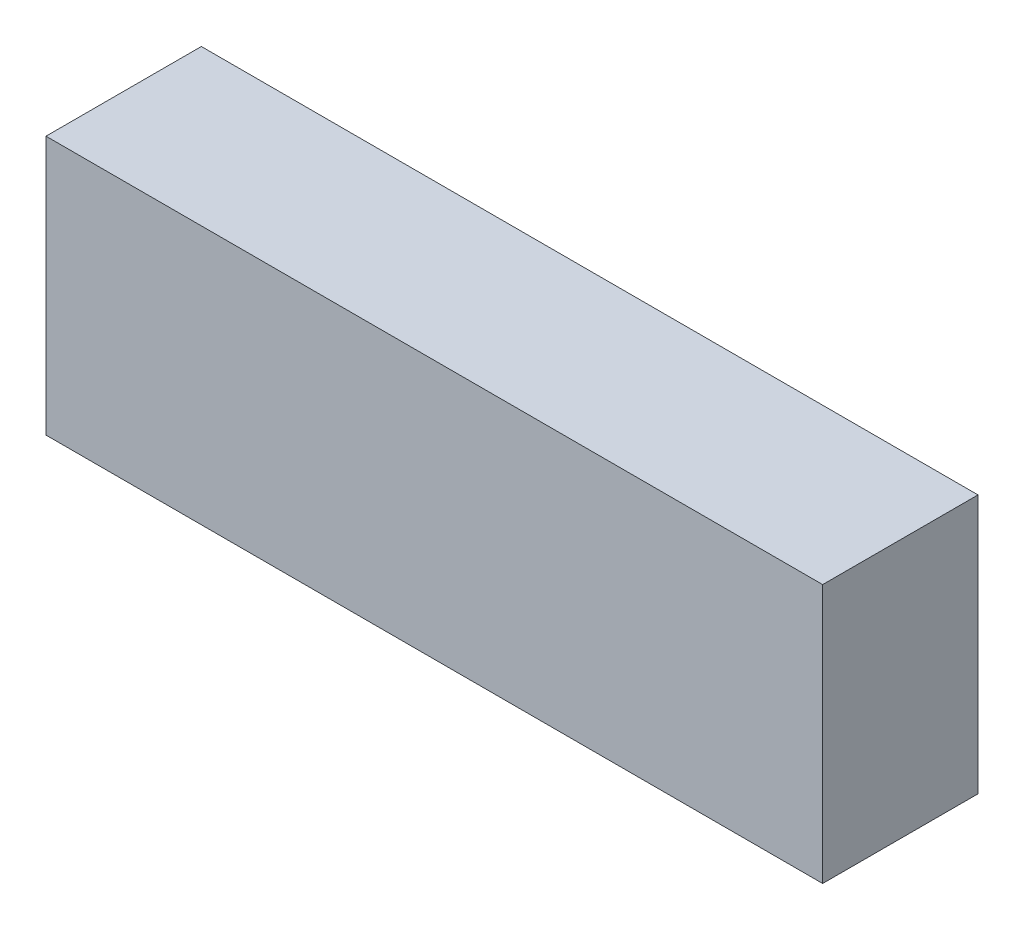
ISO-10303-21;
HEADER;
FILE_DESCRIPTION(('STEP AP214'),'2;1');
FILE_NAME('part.step','',(''),(''),'','','');
FILE_SCHEMA(('AUTOMOTIVE_DESIGN { 1 0 10303 214 1 1 1 1 }'));
ENDSEC;
DATA;
#1=APPLICATION_CONTEXT('core data for automotive mechanical design processes');
#2=APPLICATION_PROTOCOL_DEFINITION('international standard','automotive_design',2000,#1);
#3=PRODUCT_CONTEXT('',#1,'mechanical');
#4=PRODUCT('Part','Part','',(#3));
#5=PRODUCT_RELATED_PRODUCT_CATEGORY('part','',(#4));
#6=PRODUCT_DEFINITION_FORMATION('','',#4);
#7=PRODUCT_DEFINITION_CONTEXT('part definition',#1,'design');
#8=PRODUCT_DEFINITION('design','',#6,#7);
#9=PRODUCT_DEFINITION_SHAPE('','',#8);
#10=(LENGTH_UNIT() NAMED_UNIT(*) SI_UNIT(.MILLI.,.METRE.));
#11=(NAMED_UNIT(*) PLANE_ANGLE_UNIT() SI_UNIT($,.RADIAN.));
#12=(NAMED_UNIT(*) SI_UNIT($,.STERADIAN.) SOLID_ANGLE_UNIT());
#13=UNCERTAINTY_MEASURE_WITH_UNIT(LENGTH_MEASURE(1.E-05),#10,'distance_accuracy_value','');
#14=(GEOMETRIC_REPRESENTATION_CONTEXT(3) GLOBAL_UNCERTAINTY_ASSIGNED_CONTEXT((#13)) GLOBAL_UNIT_ASSIGNED_CONTEXT((#10,
#11,#12)) REPRESENTATION_CONTEXT('',''));
#15=CARTESIAN_POINT('',(0.,0.,0.));
#16=DIRECTION('',(0.,0.,1.));
#17=DIRECTION('',(1.,0.,0.));
#18=AXIS2_PLACEMENT_3D('',#15,#16,#17);
#19=CARTESIAN_POINT('',(0.,0.,6.));
#20=DIRECTION('',(1.,0.,0.));
#21=DIRECTION('',(0.,0.,-1.));
#22=AXIS2_PLACEMENT_3D('',#19,#20,#21);
#23=PLANE('',#22);
#24=DIRECTION('',(0.,-1.,0.));
#25=VECTOR('',#24,1.);
#26=CARTESIAN_POINT('',(0.,0.,0.));
#27=LINE('',#26,#25);
#28=CARTESIAN_POINT('',(0.,10.,0.));
#29=VERTEX_POINT('',#28);
#30=CARTESIAN_POINT('',(0.,0.,0.));
#31=VERTEX_POINT('',#30);
#32=EDGE_CURVE('E111',#29,#31,#27,.T.);
#33=ORIENTED_EDGE('',*,*,#32,.T.);
#34=DIRECTION('',(0.,0.,-1.));
#35=VECTOR('',#34,1.);
#36=CARTESIAN_POINT('',(0.,0.,6.));
#37=LINE('',#36,#35);
#38=CARTESIAN_POINT('',(0.,0.,6.));
#39=VERTEX_POINT('',#38);
#40=EDGE_CURVE('E11',#39,#31,#37,.T.);
#41=ORIENTED_EDGE('',*,*,#40,.F.);
#42=DIRECTION('',(0.,-1.,0.));
#43=VECTOR('',#42,1.);
#44=CARTESIAN_POINT('',(0.,0.,6.));
#45=LINE('',#44,#43);
#46=CARTESIAN_POINT('',(0.,10.,6.));
#47=VERTEX_POINT('',#46);
#48=EDGE_CURVE('E95',#47,#39,#45,.T.);
#49=ORIENTED_EDGE('',*,*,#48,.F.);
#50=DIRECTION('',(0.,0.,-1.));
#51=VECTOR('',#50,1.);
#52=CARTESIAN_POINT('',(0.,10.,6.));
#53=LINE('',#52,#51);
#54=EDGE_CURVE('E107',#47,#29,#53,.T.);
#55=ORIENTED_EDGE('',*,*,#54,.T.);
#56=EDGE_LOOP('',(#33,#41,#49,#55));
#57=FACE_BOUND('',#56,.T.);
#58=ADVANCED_FACE('F43',(#57),#23,.F.);
#59=CARTESIAN_POINT('',(0.,0.,6.));
#60=DIRECTION('',(0.,1.,0.));
#61=DIRECTION('',(0.,0.,1.));
#62=AXIS2_PLACEMENT_3D('',#59,#60,#61);
#63=PLANE('',#62);
#64=DIRECTION('',(1.,0.,0.));
#65=VECTOR('',#64,1.);
#66=CARTESIAN_POINT('',(0.,0.,0.));
#67=LINE('',#66,#65);
#68=CARTESIAN_POINT('',(30.,0.,0.));
#69=VERTEX_POINT('',#68);
#70=EDGE_CURVE('E100',#31,#69,#67,.T.);
#71=ORIENTED_EDGE('',*,*,#70,.T.);
#72=DIRECTION('',(0.,0.,-1.));
#73=VECTOR('',#72,1.);
#74=CARTESIAN_POINT('',(30.,0.,6.));
#75=LINE('',#74,#73);
#76=CARTESIAN_POINT('',(30.,0.,6.));
#77=VERTEX_POINT('',#76);
#78=EDGE_CURVE('E52',#77,#69,#75,.T.);
#79=ORIENTED_EDGE('',*,*,#78,.F.);
#80=DIRECTION('',(1.,0.,0.));
#81=VECTOR('',#80,1.);
#82=CARTESIAN_POINT('',(0.,0.,6.));
#83=LINE('',#82,#81);
#84=EDGE_CURVE('E90',#39,#77,#83,.T.);
#85=ORIENTED_EDGE('',*,*,#84,.F.);
#86=ORIENTED_EDGE('',*,*,#40,.T.);
#87=EDGE_LOOP('',(#71,#79,#85,#86));
#88=FACE_BOUND('',#87,.T.);
#89=ADVANCED_FACE('F99',(#88),#63,.F.);
#90=CARTESIAN_POINT('',(30.,0.,6.));
#91=DIRECTION('',(-1.,0.,0.));
#92=DIRECTION('',(0.,0.,1.));
#93=AXIS2_PLACEMENT_3D('',#90,#91,#92);
#94=PLANE('',#93);
#95=DIRECTION('',(0.,1.,0.));
#96=VECTOR('',#95,1.);
#97=CARTESIAN_POINT('',(30.,0.,0.));
#98=LINE('',#97,#96);
#99=CARTESIAN_POINT('',(30.,10.,0.));
#100=VERTEX_POINT('',#99);
#101=EDGE_CURVE('E77',#69,#100,#98,.T.);
#102=ORIENTED_EDGE('',*,*,#101,.T.);
#103=DIRECTION('',(0.,0.,-1.));
#104=VECTOR('',#103,1.);
#105=CARTESIAN_POINT('',(30.,10.,6.));
#106=LINE('',#105,#104);
#107=CARTESIAN_POINT('',(30.,10.,6.));
#108=VERTEX_POINT('',#107);
#109=EDGE_CURVE('E102',#108,#100,#106,.T.);
#110=ORIENTED_EDGE('',*,*,#109,.F.);
#111=DIRECTION('',(0.,1.,0.));
#112=VECTOR('',#111,1.);
#113=CARTESIAN_POINT('',(30.,0.,6.));
#114=LINE('',#113,#112);
#115=EDGE_CURVE('E93',#77,#108,#114,.T.);
#116=ORIENTED_EDGE('',*,*,#115,.F.);
#117=ORIENTED_EDGE('',*,*,#78,.T.);
#118=EDGE_LOOP('',(#102,#110,#116,#117));
#119=FACE_BOUND('',#118,.T.);
#120=ADVANCED_FACE('F103',(#119),#94,.F.);
#121=CARTESIAN_POINT('',(0.,10.,6.));
#122=DIRECTION('',(0.,-1.,0.));
#123=DIRECTION('',(0.,0.,-1.));
#124=AXIS2_PLACEMENT_3D('',#121,#122,#123);
#125=PLANE('',#124);
#126=DIRECTION('',(-1.,0.,0.));
#127=VECTOR('',#126,1.);
#128=CARTESIAN_POINT('',(0.,10.,0.));
#129=LINE('',#128,#127);
#130=EDGE_CURVE('E83',#100,#29,#129,.T.);
#131=ORIENTED_EDGE('',*,*,#130,.T.);
#132=ORIENTED_EDGE('',*,*,#54,.F.);
#133=DIRECTION('',(-1.,0.,0.));
#134=VECTOR('',#133,1.);
#135=CARTESIAN_POINT('',(0.,10.,6.));
#136=LINE('',#135,#134);
#137=EDGE_CURVE('E60',#108,#47,#136,.T.);
#138=ORIENTED_EDGE('',*,*,#137,.F.);
#139=ORIENTED_EDGE('',*,*,#109,.T.);
#140=EDGE_LOOP('',(#131,#132,#138,#139));
#141=FACE_BOUND('',#140,.T.);
#142=ADVANCED_FACE('F124',(#141),#125,.F.);
#143=CARTESIAN_POINT('',(0.,0.,6.));
#144=DIRECTION('',(0.,0.,-1.));
#145=DIRECTION('',(-1.,0.,0.));
#146=AXIS2_PLACEMENT_3D('',#143,#144,#145);
#147=PLANE('',#146);
#148=ORIENTED_EDGE('',*,*,#48,.T.);
#149=ORIENTED_EDGE('',*,*,#84,.T.);
#150=ORIENTED_EDGE('',*,*,#115,.T.);
#151=ORIENTED_EDGE('',*,*,#137,.T.);
#152=EDGE_LOOP('',(#148,#149,#150,#151));
#153=FACE_BOUND('',#152,.T.);
#154=ADVANCED_FACE('F91',(#153),#147,.F.);
#155=CARTESIAN_POINT('',(0.,0.,0.));
#156=DIRECTION('',(0.,0.,-1.));
#157=DIRECTION('',(-1.,0.,0.));
#158=AXIS2_PLACEMENT_3D('',#155,#156,#157);
#159=PLANE('',#158);
#160=ORIENTED_EDGE('',*,*,#32,.F.);
#161=ORIENTED_EDGE('',*,*,#130,.F.);
#162=ORIENTED_EDGE('',*,*,#101,.F.);
#163=ORIENTED_EDGE('',*,*,#70,.F.);
#164=EDGE_LOOP('',(#160,#161,#162,#163));
#165=FACE_BOUND('',#164,.T.);
#166=ADVANCED_FACE('F127',(#165),#159,.T.);
#167=CLOSED_SHELL('',(#58,#89,#120,#142,#154,#166));
#168=MANIFOLD_SOLID_BREP('B2',#167);
#169=ADVANCED_BREP_SHAPE_REPRESENTATION('',(#18,#168),#14);
#170=SHAPE_DEFINITION_REPRESENTATION(#9,#169);
ENDSEC;
END-ISO-10303-21;
